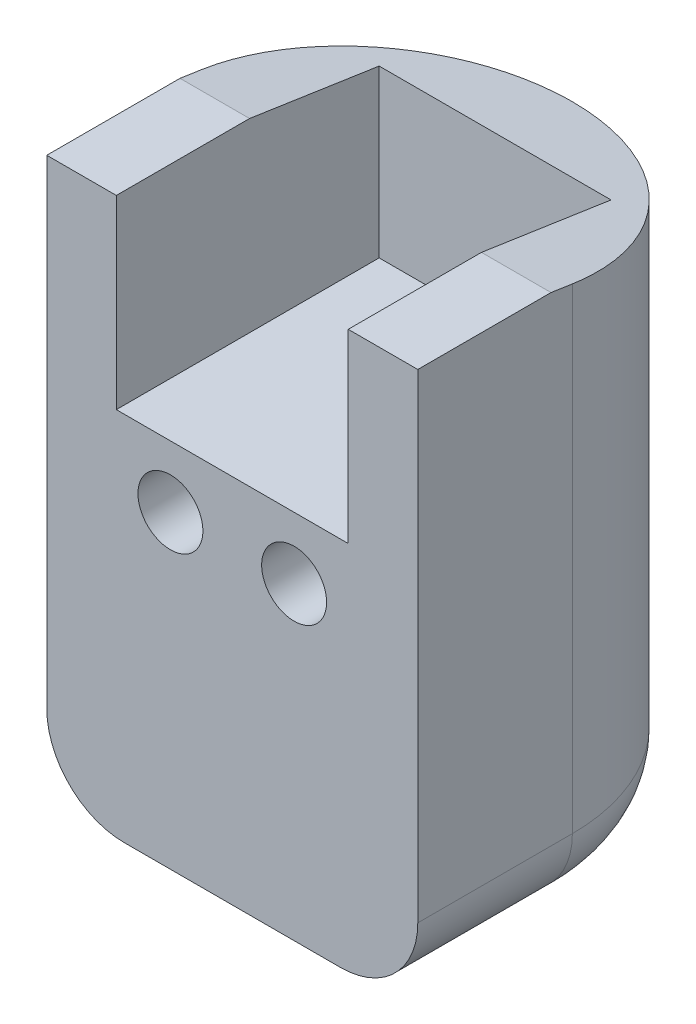
ISO-10303-21;
HEADER;
FILE_DESCRIPTION(('STEP AP214'),'2;1');
FILE_NAME('part.step','',(''),(''),'','','');
FILE_SCHEMA(('AUTOMOTIVE_DESIGN { 1 0 10303 214 1 1 1 1 }'));
ENDSEC;
DATA;
#1=APPLICATION_CONTEXT('core data for automotive mechanical design processes');
#2=APPLICATION_PROTOCOL_DEFINITION('international standard','automotive_design',2000,#1);
#3=PRODUCT_CONTEXT('',#1,'mechanical');
#4=PRODUCT('Part','Part','',(#3));
#5=PRODUCT_RELATED_PRODUCT_CATEGORY('part','',(#4));
#6=PRODUCT_DEFINITION_FORMATION('','',#4);
#7=PRODUCT_DEFINITION_CONTEXT('part definition',#1,'design');
#8=PRODUCT_DEFINITION('design','',#6,#7);
#9=PRODUCT_DEFINITION_SHAPE('','',#8);
#10=(LENGTH_UNIT() NAMED_UNIT(*) SI_UNIT(.MILLI.,.METRE.));
#11=(NAMED_UNIT(*) PLANE_ANGLE_UNIT() SI_UNIT($,.RADIAN.));
#12=(NAMED_UNIT(*) SI_UNIT($,.STERADIAN.) SOLID_ANGLE_UNIT());
#13=UNCERTAINTY_MEASURE_WITH_UNIT(LENGTH_MEASURE(1.E-05),#10,'distance_accuracy_value','');
#14=(GEOMETRIC_REPRESENTATION_CONTEXT(3) GLOBAL_UNCERTAINTY_ASSIGNED_CONTEXT((#13)) GLOBAL_UNIT_ASSIGNED_CONTEXT((#10,
#11,#12)) REPRESENTATION_CONTEXT('',''));
#15=CARTESIAN_POINT('',(0.,0.,0.));
#16=DIRECTION('',(0.,0.,1.));
#17=DIRECTION('',(1.,0.,0.));
#18=AXIS2_PLACEMENT_3D('',#15,#16,#17);
#19=CARTESIAN_POINT('',(-7.5,0.,10.));
#20=DIRECTION('',(0.,-1.,0.));
#21=DIRECTION('',(1.,0.,0.));
#22=AXIS2_PLACEMENT_3D('',#19,#20,#21);
#23=PLANE('',#22);
#24=DIRECTION('',(0.,0.,-1.));
#25=VECTOR('',#24,1.);
#26=CARTESIAN_POINT('',(12.,0.,10.));
#27=LINE('',#26,#25);
#28=CARTESIAN_POINT('',(12.,0.,10.));
#29=VERTEX_POINT('',#28);
#30=CARTESIAN_POINT('',(12.,0.,1.38231247663545));
#31=VERTEX_POINT('',#30);
#32=EDGE_CURVE('E205',#29,#31,#27,.T.);
#33=ORIENTED_EDGE('',*,*,#32,.T.);
#34=DIRECTION('',(1.,0.,0.));
#35=VECTOR('',#34,1.);
#36=CARTESIAN_POINT('',(-15.,0.,1.38231247663545));
#37=LINE('',#36,#35);
#38=CARTESIAN_POINT('',(7.5,0.,1.38231247663545));
#39=VERTEX_POINT('',#38);
#40=EDGE_CURVE('E177',#39,#31,#37,.T.);
#41=ORIENTED_EDGE('',*,*,#40,.F.);
#42=DIRECTION('',(0.,0.,-1.));
#43=VECTOR('',#42,1.);
#44=CARTESIAN_POINT('',(7.5,0.,10.));
#45=LINE('',#44,#43);
#46=CARTESIAN_POINT('',(7.5,0.,10.));
#47=VERTEX_POINT('',#46);
#48=EDGE_CURVE('E214',#47,#39,#45,.T.);
#49=ORIENTED_EDGE('',*,*,#48,.F.);
#50=DIRECTION('',(-1.,0.,0.));
#51=VECTOR('',#50,1.);
#52=CARTESIAN_POINT('',(12.,0.,10.));
#53=LINE('',#52,#51);
#54=EDGE_CURVE('E146',#29,#47,#53,.T.);
#55=ORIENTED_EDGE('',*,*,#54,.F.);
#56=EDGE_LOOP('',(#33,#41,#49,#55));
#57=FACE_BOUND('',#56,.T.);
#58=ADVANCED_FACE('F36',(#57),#23,.F.);
#59=CARTESIAN_POINT('',(7.5,-11.,10.));
#60=DIRECTION('',(1.,0.,0.));
#61=DIRECTION('',(0.,1.,0.));
#62=AXIS2_PLACEMENT_3D('',#59,#60,#61);
#63=PLANE('',#62);
#64=ORIENTED_EDGE('',*,*,#48,.T.);
#65=DIRECTION('',(0.,-0.147809411129604,-0.989015863361918));
#66=VECTOR('',#65,1.);
#67=CARTESIAN_POINT('',(7.5,1.01946015378364,8.20367964434118));
#68=LINE('',#67,#66);
#69=CARTESIAN_POINT('',(7.5,-1.2527449932544,-7.));
#70=VERTEX_POINT('',#69);
#71=EDGE_CURVE('E184',#39,#70,#68,.T.);
#72=ORIENTED_EDGE('',*,*,#71,.T.);
#73=DIRECTION('',(0.,-1.,0.));
#74=VECTOR('',#73,1.);
#75=CARTESIAN_POINT('',(7.5,26.8328157299975,-7.));
#76=LINE('',#75,#74);
#77=CARTESIAN_POINT('',(7.5,-12.,-7.));
#78=VERTEX_POINT('',#77);
#79=EDGE_CURVE('E157',#70,#78,#76,.T.);
#80=ORIENTED_EDGE('',*,*,#79,.T.);
#81=DIRECTION('',(0.,0.,-1.));
#82=VECTOR('',#81,1.);
#83=CARTESIAN_POINT('',(7.5,-12.,10.));
#84=LINE('',#83,#82);
#85=CARTESIAN_POINT('',(7.5,-12.,10.));
#86=VERTEX_POINT('',#85);
#87=EDGE_CURVE('E153',#86,#78,#84,.T.);
#88=ORIENTED_EDGE('',*,*,#87,.F.);
#89=DIRECTION('',(0.,-1.,0.));
#90=VECTOR('',#89,1.);
#91=CARTESIAN_POINT('',(7.5,-11.,10.));
#92=LINE('',#91,#90);
#93=EDGE_CURVE('E139',#47,#86,#92,.T.);
#94=ORIENTED_EDGE('',*,*,#93,.F.);
#95=EDGE_LOOP('',(#64,#72,#80,#88,#94));
#96=FACE_BOUND('',#95,.T.);
#97=ADVANCED_FACE('F154',(#96),#63,.F.);
#98=CARTESIAN_POINT('',(-7.5,0.,10.));
#99=DIRECTION('',(-1.,0.,0.));
#100=DIRECTION('',(0.,-1.,0.));
#101=AXIS2_PLACEMENT_3D('',#98,#99,#100);
#102=PLANE('',#101);
#103=DIRECTION('',(0.,-1.,0.));
#104=VECTOR('',#103,1.);
#105=CARTESIAN_POINT('',(-7.5,26.8328157299975,-7.));
#106=LINE('',#105,#104);
#107=CARTESIAN_POINT('',(-7.5,-1.2527449932544,-7.));
#108=VERTEX_POINT('',#107);
#109=CARTESIAN_POINT('',(-7.5,-12.,-7.));
#110=VERTEX_POINT('',#109);
#111=EDGE_CURVE('E192',#108,#110,#106,.T.);
#112=ORIENTED_EDGE('',*,*,#111,.F.);
#113=DIRECTION('',(0.,0.147809411129604,0.989015863361918));
#114=VECTOR('',#113,1.);
#115=CARTESIAN_POINT('',(-7.5,1.25978399598692,9.81172402031616));
#116=LINE('',#115,#114);
#117=CARTESIAN_POINT('',(-7.5,0.,1.38231247663545));
#118=VERTEX_POINT('',#117);
#119=EDGE_CURVE('E181',#108,#118,#116,.T.);
#120=ORIENTED_EDGE('',*,*,#119,.T.);
#121=DIRECTION('',(0.,0.,-1.));
#122=VECTOR('',#121,1.);
#123=CARTESIAN_POINT('',(-7.5,0.,10.));
#124=LINE('',#123,#122);
#125=CARTESIAN_POINT('',(-7.5,0.,10.));
#126=VERTEX_POINT('',#125);
#127=EDGE_CURVE('E211',#126,#118,#124,.T.);
#128=ORIENTED_EDGE('',*,*,#127,.F.);
#129=DIRECTION('',(0.,1.,0.));
#130=VECTOR('',#129,1.);
#131=CARTESIAN_POINT('',(-7.5,0.,10.));
#132=LINE('',#131,#130);
#133=CARTESIAN_POINT('',(-7.5,-12.,10.));
#134=VERTEX_POINT('',#133);
#135=EDGE_CURVE('E150',#134,#126,#132,.T.);
#136=ORIENTED_EDGE('',*,*,#135,.F.);
#137=DIRECTION('',(0.,0.,1.));
#138=VECTOR('',#137,1.);
#139=CARTESIAN_POINT('',(-7.5,-12.,-7.));
#140=LINE('',#139,#138);
#141=EDGE_CURVE('E166',#110,#134,#140,.T.);
#142=ORIENTED_EDGE('',*,*,#141,.F.);
#143=EDGE_LOOP('',(#112,#120,#128,#136,#142));
#144=FACE_BOUND('',#143,.T.);
#145=ADVANCED_FACE('F312',(#144),#102,.F.);
#146=ORIENTED_EDGE('',*,*,#127,.T.);
#147=CARTESIAN_POINT('',(-12.,0.,1.38231247663545));
#148=VERTEX_POINT('',#147);
#149=EDGE_CURVE('E180',#148,#118,#37,.T.);
#150=ORIENTED_EDGE('',*,*,#149,.F.);
#151=DIRECTION('',(0.,0.,-1.));
#152=VECTOR('',#151,1.);
#153=CARTESIAN_POINT('',(-12.,0.,10.));
#154=LINE('',#153,#152);
#155=CARTESIAN_POINT('',(-12.,0.,10.));
#156=VERTEX_POINT('',#155);
#157=EDGE_CURVE('E208',#156,#148,#154,.T.);
#158=ORIENTED_EDGE('',*,*,#157,.F.);
#159=DIRECTION('',(-1.,0.,0.));
#160=VECTOR('',#159,1.);
#161=CARTESIAN_POINT('',(-7.5,0.,10.));
#162=LINE('',#161,#160);
#163=EDGE_CURVE('E196',#126,#156,#162,.T.);
#164=ORIENTED_EDGE('',*,*,#163,.F.);
#165=EDGE_LOOP('',(#146,#150,#158,#164));
#166=FACE_BOUND('',#165,.T.);
#167=ADVANCED_FACE('F308',(#166),#23,.F.);
#168=CARTESIAN_POINT('',(-12.,0.,10.));
#169=DIRECTION('',(1.,0.,0.));
#170=DIRECTION('',(0.,1.,0.));
#171=AXIS2_PLACEMENT_3D('',#168,#169,#170);
#172=PLANE('',#171);
#173=DIRECTION('',(0.,1.,0.));
#174=VECTOR('',#173,1.);
#175=CARTESIAN_POINT('',(-12.,-36.,0.));
#176=LINE('',#175,#174);
#177=CARTESIAN_POINT('',(-12.,-0.206587983810551,0.));
#178=VERTEX_POINT('',#177);
#179=CARTESIAN_POINT('',(-12.,-31.,0.));
#180=VERTEX_POINT('',#179);
#181=EDGE_CURVE('E223',#178,#180,#176,.F.);
#182=ORIENTED_EDGE('',*,*,#181,.T.);
#183=DIRECTION('',(0.,0.,-1.));
#184=VECTOR('',#183,1.);
#185=CARTESIAN_POINT('',(-12.,-31.,10.));
#186=LINE('',#185,#184);
#187=CARTESIAN_POINT('',(-12.,-31.,10.));
#188=VERTEX_POINT('',#187);
#189=EDGE_CURVE('E237',#180,#188,#186,.F.);
#190=ORIENTED_EDGE('',*,*,#189,.T.);
#191=DIRECTION('',(0.,-1.,0.));
#192=VECTOR('',#191,1.);
#193=CARTESIAN_POINT('',(-12.,0.,10.));
#194=LINE('',#193,#192);
#195=EDGE_CURVE('E198',#156,#188,#194,.T.);
#196=ORIENTED_EDGE('',*,*,#195,.F.);
#197=ORIENTED_EDGE('',*,*,#157,.T.);
#198=DIRECTION('',(0.,-0.147809411129604,-0.989015863361918));
#199=VECTOR('',#198,1.);
#200=CARTESIAN_POINT('',(-12.,1.25978399598692,9.81172402031616));
#201=LINE('',#200,#199);
#202=EDGE_CURVE('E188',#148,#178,#201,.T.);
#203=ORIENTED_EDGE('',*,*,#202,.T.);
#204=EDGE_LOOP('',(#182,#190,#196,#197,#203));
#205=FACE_BOUND('',#204,.T.);
#206=ADVANCED_FACE('F304',(#205),#172,.F.);
#207=CARTESIAN_POINT('',(-12.,-36.,10.));
#208=DIRECTION('',(0.,1.,0.));
#209=DIRECTION('',(0.,0.,1.));
#210=AXIS2_PLACEMENT_3D('',#207,#208,#209);
#211=PLANE('',#210);
#212=DIRECTION('',(1.,0.,0.));
#213=VECTOR('',#212,1.);
#214=CARTESIAN_POINT('',(-12.,-36.,10.));
#215=LINE('',#214,#213);
#216=CARTESIAN_POINT('',(-7.,-36.,10.));
#217=VERTEX_POINT('',#216);
#218=CARTESIAN_POINT('',(7.,-36.,10.));
#219=VERTEX_POINT('',#218);
#220=EDGE_CURVE('E200',#217,#219,#215,.T.);
#221=ORIENTED_EDGE('',*,*,#220,.F.);
#222=DIRECTION('',(0.,0.,-1.));
#223=VECTOR('',#222,1.);
#224=CARTESIAN_POINT('',(-7.,-36.,10.));
#225=LINE('',#224,#223);
#226=CARTESIAN_POINT('',(-7.,-36.,0.));
#227=VERTEX_POINT('',#226);
#228=EDGE_CURVE('E234',#217,#227,#225,.T.);
#229=ORIENTED_EDGE('',*,*,#228,.T.);
#230=CARTESIAN_POINT('',(0.,-36.,0.));
#231=DIRECTION('',(0.,1.,0.));
#232=DIRECTION('',(0.,0.,1.));
#233=AXIS2_PLACEMENT_3D('',#230,#231,#232);
#234=CIRCLE('',#233,7.);
#235=CARTESIAN_POINT('',(0.,-36.,-7.));
#236=VERTEX_POINT('',#235);
#237=EDGE_CURVE('E232',#227,#236,#234,.F.);
#238=ORIENTED_EDGE('',*,*,#237,.T.);
#239=CARTESIAN_POINT('',(0.,-36.,0.));
#240=DIRECTION('',(0.,1.,0.));
#241=DIRECTION('',(0.,0.,1.));
#242=AXIS2_PLACEMENT_3D('',#239,#240,#241);
#243=CIRCLE('',#242,7.);
#244=CARTESIAN_POINT('',(7.,-36.,0.));
#245=VERTEX_POINT('',#244);
#246=EDGE_CURVE('E230',#236,#245,#243,.F.);
#247=ORIENTED_EDGE('',*,*,#246,.T.);
#248=DIRECTION('',(0.,0.,-1.));
#249=VECTOR('',#248,1.);
#250=CARTESIAN_POINT('',(7.,-36.,10.));
#251=LINE('',#250,#249);
#252=EDGE_CURVE('E227',#245,#219,#251,.F.);
#253=ORIENTED_EDGE('',*,*,#252,.T.);
#254=EDGE_LOOP('',(#221,#229,#238,#247,#253));
#255=FACE_BOUND('',#254,.T.);
#256=ADVANCED_FACE('F301',(#255),#211,.F.);
#257=CARTESIAN_POINT('',(12.,-36.,10.));
#258=DIRECTION('',(-1.,0.,0.));
#259=DIRECTION('',(0.,-1.,0.));
#260=AXIS2_PLACEMENT_3D('',#257,#258,#259);
#261=PLANE('',#260);
#262=DIRECTION('',(0.,1.,0.));
#263=VECTOR('',#262,1.);
#264=CARTESIAN_POINT('',(12.,-36.,10.));
#265=LINE('',#264,#263);
#266=CARTESIAN_POINT('',(12.,-31.,10.));
#267=VERTEX_POINT('',#266);
#268=EDGE_CURVE('E203',#267,#29,#265,.T.);
#269=ORIENTED_EDGE('',*,*,#268,.F.);
#270=DIRECTION('',(0.,0.,-1.));
#271=VECTOR('',#270,1.);
#272=CARTESIAN_POINT('',(12.,-31.,10.));
#273=LINE('',#272,#271);
#274=CARTESIAN_POINT('',(12.,-31.,0.));
#275=VERTEX_POINT('',#274);
#276=EDGE_CURVE('E11',#267,#275,#273,.T.);
#277=ORIENTED_EDGE('',*,*,#276,.T.);
#278=DIRECTION('',(0.,-1.,0.));
#279=VECTOR('',#278,1.);
#280=CARTESIAN_POINT('',(12.,-2.,0.));
#281=LINE('',#280,#279);
#282=CARTESIAN_POINT('',(12.,-0.206587983810555,0.));
#283=VERTEX_POINT('',#282);
#284=EDGE_CURVE('E226',#275,#283,#281,.F.);
#285=ORIENTED_EDGE('',*,*,#284,.T.);
#286=DIRECTION('',(0.,0.147809411129604,0.989015863361918));
#287=VECTOR('',#286,1.);
#288=CARTESIAN_POINT('',(12.,0.473269603321627,4.54903333530713));
#289=LINE('',#288,#287);
#290=EDGE_CURVE('E186',#283,#31,#289,.T.);
#291=ORIENTED_EDGE('',*,*,#290,.T.);
#292=ORIENTED_EDGE('',*,*,#32,.F.);
#293=EDGE_LOOP('',(#269,#277,#285,#291,#292));
#294=FACE_BOUND('',#293,.T.);
#295=ADVANCED_FACE('F297',(#294),#261,.F.);
#296=CARTESIAN_POINT('',(0.,0.,10.));
#297=DIRECTION('',(0.,0.,-1.));
#298=DIRECTION('',(-1.,0.,0.));
#299=AXIS2_PLACEMENT_3D('',#296,#297,#298);
#300=PLANE('',#299);
#301=CARTESIAN_POINT('',(-4.,-16.,10.));
#302=DIRECTION('',(0.,0.,1.));
#303=DIRECTION('',(-1.,0.,0.));
#304=AXIS2_PLACEMENT_3D('',#301,#302,#303);
#305=CIRCLE('',#304,2.1);
#306=CARTESIAN_POINT('',(-6.1,-16.,10.));
#307=VERTEX_POINT('',#306);
#308=EDGE_CURVE('E263',#307,#307,#305,.T.);
#309=ORIENTED_EDGE('',*,*,#308,.F.);
#310=EDGE_LOOP('',(#309));
#311=FACE_BOUND('',#310,.T.);
#312=CARTESIAN_POINT('',(4.,-16.,10.));
#313=DIRECTION('',(0.,0.,1.));
#314=DIRECTION('',(1.,0.,0.));
#315=AXIS2_PLACEMENT_3D('',#312,#313,#314);
#316=CIRCLE('',#315,2.1);
#317=CARTESIAN_POINT('',(6.1,-16.,10.));
#318=VERTEX_POINT('',#317);
#319=EDGE_CURVE('E172',#318,#318,#316,.T.);
#320=ORIENTED_EDGE('',*,*,#319,.F.);
#321=EDGE_LOOP('',(#320));
#322=FACE_BOUND('',#321,.T.);
#323=ORIENTED_EDGE('',*,*,#195,.T.);
#324=CARTESIAN_POINT('',(-7.,-31.,10.));
#325=DIRECTION('',(0.,0.,-1.));
#326=DIRECTION('',(-1.,0.,0.));
#327=AXIS2_PLACEMENT_3D('',#324,#325,#326);
#328=CIRCLE('',#327,5.);
#329=EDGE_CURVE('E241',#188,#217,#328,.F.);
#330=ORIENTED_EDGE('',*,*,#329,.T.);
#331=ORIENTED_EDGE('',*,*,#220,.T.);
#332=CARTESIAN_POINT('',(7.,-31.,10.));
#333=DIRECTION('',(0.,0.,-1.));
#334=DIRECTION('',(-1.,0.,0.));
#335=AXIS2_PLACEMENT_3D('',#332,#333,#334);
#336=CIRCLE('',#335,5.);
#337=EDGE_CURVE('E239',#219,#267,#336,.F.);
#338=ORIENTED_EDGE('',*,*,#337,.T.);
#339=ORIENTED_EDGE('',*,*,#268,.T.);
#340=ORIENTED_EDGE('',*,*,#54,.T.);
#341=ORIENTED_EDGE('',*,*,#93,.T.);
#342=DIRECTION('',(1.,0.,0.));
#343=VECTOR('',#342,1.);
#344=CARTESIAN_POINT('',(-7.5,-12.,10.));
#345=LINE('',#344,#343);
#346=EDGE_CURVE('E144',#134,#86,#345,.T.);
#347=ORIENTED_EDGE('',*,*,#346,.F.);
#348=ORIENTED_EDGE('',*,*,#135,.T.);
#349=ORIENTED_EDGE('',*,*,#163,.T.);
#350=EDGE_LOOP('',(#323,#330,#331,#338,#339,#340,#341,#347,#348,#349));
#351=FACE_BOUND('',#350,.T.);
#352=ADVANCED_FACE('F142',(#311,#322,#351),#300,.F.);
#353=CARTESIAN_POINT('',(-7.5,26.8328157299975,-7.));
#354=DIRECTION('',(0.,0.,-1.));
#355=DIRECTION('',(-1.,0.,0.));
#356=AXIS2_PLACEMENT_3D('',#353,#354,#355);
#357=PLANE('',#356);
#358=ORIENTED_EDGE('',*,*,#79,.F.);
#359=DIRECTION('',(-1.,0.,0.));
#360=VECTOR('',#359,1.);
#361=CARTESIAN_POINT('',(-7.5,-1.2527449932544,-7.));
#362=LINE('',#361,#360);
#363=EDGE_CURVE('E216',#70,#108,#362,.T.);
#364=ORIENTED_EDGE('',*,*,#363,.T.);
#365=ORIENTED_EDGE('',*,*,#111,.T.);
#366=DIRECTION('',(-1.,0.,0.));
#367=VECTOR('',#366,1.);
#368=CARTESIAN_POINT('',(7.5,-12.,-7.));
#369=LINE('',#368,#367);
#370=EDGE_CURVE('E161',#78,#110,#369,.T.);
#371=ORIENTED_EDGE('',*,*,#370,.F.);
#372=EDGE_LOOP('',(#358,#364,#365,#371));
#373=FACE_BOUND('',#372,.T.);
#374=ADVANCED_FACE('F290',(#373),#357,.F.);
#375=CARTESIAN_POINT('',(-15.,0.,1.38231247663545));
#376=DIRECTION('',(0.,-0.989015863361918,0.147809411129604));
#377=DIRECTION('',(0.,-0.147809411129604,-0.989015863361918));
#378=AXIS2_PLACEMENT_3D('',#375,#376,#377);
#379=PLANE('',#378);
#380=CARTESIAN_POINT('',(0.,-0.20658798381055,0.));
#381=DIRECTION('',(0.,-0.989015863361918,0.147809411129604));
#382=DIRECTION('',(0.,0.147809411129604,0.989015863361918));
#383=AXIS2_PLACEMENT_3D('',#380,#381,#382);
#384=ELLIPSE('',#383,12.1332735343687,12.);
#385=CARTESIAN_POINT('',(0.,-2.,-12.));
#386=VERTEX_POINT('',#385);
#387=EDGE_CURVE('E219',#283,#386,#384,.F.);
#388=ORIENTED_EDGE('',*,*,#387,.T.);
#389=CARTESIAN_POINT('',(0.,-0.20658798381055,0.));
#390=DIRECTION('',(0.,-0.989015863361918,0.147809411129604));
#391=DIRECTION('',(0.,-0.147809411129604,-0.989015863361918));
#392=AXIS2_PLACEMENT_3D('',#389,#390,#391);
#393=ELLIPSE('',#392,12.1332735343687,12.);
#394=EDGE_CURVE('E221',#386,#178,#393,.F.);
#395=ORIENTED_EDGE('',*,*,#394,.T.);
#396=ORIENTED_EDGE('',*,*,#202,.F.);
#397=ORIENTED_EDGE('',*,*,#149,.T.);
#398=ORIENTED_EDGE('',*,*,#119,.F.);
#399=ORIENTED_EDGE('',*,*,#363,.F.);
#400=ORIENTED_EDGE('',*,*,#71,.F.);
#401=ORIENTED_EDGE('',*,*,#40,.T.);
#402=ORIENTED_EDGE('',*,*,#290,.F.);
#403=EDGE_LOOP('',(#388,#395,#396,#397,#398,#399,#400,#401,#402));
#404=FACE_BOUND('',#403,.T.);
#405=ADVANCED_FACE('F287',(#404),#379,.F.);
#406=CARTESIAN_POINT('',(0.,-12.,0.));
#407=DIRECTION('',(0.,1.,0.));
#408=DIRECTION('',(-1.,0.,0.));
#409=AXIS2_PLACEMENT_3D('',#406,#407,#408);
#410=PLANE('',#409);
#411=ORIENTED_EDGE('',*,*,#346,.T.);
#412=ORIENTED_EDGE('',*,*,#87,.T.);
#413=ORIENTED_EDGE('',*,*,#370,.T.);
#414=ORIENTED_EDGE('',*,*,#141,.T.);
#415=EDGE_LOOP('',(#411,#412,#413,#414));
#416=FACE_BOUND('',#415,.T.);
#417=ADVANCED_FACE('F164',(#416),#410,.T.);
#418=CARTESIAN_POINT('',(0.,0.,0.));
#419=DIRECTION('',(0.,1.,0.));
#420=DIRECTION('',(-1.,0.,0.));
#421=AXIS2_PLACEMENT_3D('',#418,#419,#420);
#422=CYLINDRICAL_SURFACE('',#421,12.);
#423=CARTESIAN_POINT('',(7.5,-16.,-9.3674969975976));
#424=CARTESIAN_POINT('',(7.4999991056876,-16.084888503961,-9.36749804227438));
#425=CARTESIAN_POINT('',(7.49690522084914,-16.1698048029216,-9.36997741508415));
#426=CARTESIAN_POINT('',(7.48458280663904,-16.3389435950387,-9.37982302346788));
#427=CARTESIAN_POINT('',(7.47535016721512,-16.4231655850646,-9.38719253310615));
#428=CARTESIAN_POINT('',(7.4508851117428,-16.5903751772779,-9.40662294957616));
#429=CARTESIAN_POINT('',(7.43563978445456,-16.6733597216363,-9.41869395137573));
#430=CARTESIAN_POINT('',(7.39940631972288,-16.8373172015074,-9.44718548976238));
#431=CARTESIAN_POINT('',(7.37841547843726,-16.9182891702817,-9.46360807409021));
#432=CARTESIAN_POINT('',(7.3076388409915,-17.156154678684,-9.51850712180917));
#433=CARTESIAN_POINT('',(7.24983436533252,-17.309413157577,-9.5627906798396));
#434=CARTESIAN_POINT('',(7.11551266363294,-17.6030354999569,-9.66315025279993));
#435=CARTESIAN_POINT('',(7.0389975686032,-17.7434008293822,-9.71922492470124));
#436=CARTESIAN_POINT('',(6.86054847132676,-18.0243094913548,-9.84612044099187));
#437=CARTESIAN_POINT('',(6.75676668173398,-18.1632515926133,-9.91787833062149));
#438=CARTESIAN_POINT('',(6.53187339042493,-18.422627410522,-10.0674173905456));
#439=CARTESIAN_POINT('',(6.41075079221963,-18.5430491727554,-10.1452024028971));
#440=CARTESIAN_POINT('',(6.12780718844548,-18.7863620504502,-10.3190455989543));
#441=CARTESIAN_POINT('',(5.96267723996513,-18.905015793389,-10.4156709205962));
#442=CARTESIAN_POINT('',(5.61372503632557,-19.1124044776107,-10.6078138116716));
#443=CARTESIAN_POINT('',(5.42989089070778,-19.2011202303636,-10.7033306328979));
#444=CARTESIAN_POINT('',(5.13648766666483,-19.3121526847754,-10.8457128834627));
#445=CARTESIAN_POINT('',(5.03215750589088,-19.3461586081304,-10.8945386791267));
#446=CARTESIAN_POINT('',(4.81988849260674,-19.4043914160917,-10.9900949634666));
#447=CARTESIAN_POINT('',(4.71195117688801,-19.4286224091156,-11.0368263250797));
#448=CARTESIAN_POINT('',(4.4931947255749,-19.4668560644929,-11.1276788332951));
#449=CARTESIAN_POINT('',(4.38237542380199,-19.4808581356749,-11.1717998288982));
#450=CARTESIAN_POINT('',(4.15878658213689,-19.4981922074826,-11.2569440414399));
#451=CARTESIAN_POINT('',(4.04601819106857,-19.5015302915683,-11.2979690115134));
#452=CARTESIAN_POINT('',(3.82750355381387,-19.4973315650979,-11.3737694860422));
#453=CARTESIAN_POINT('',(3.72182484020862,-19.4905473047275,-11.4087817811658));
#454=CARTESIAN_POINT('',(3.51056213479567,-19.4672375618317,-11.4755486361801));
#455=CARTESIAN_POINT('',(3.40497812218881,-19.4507170652374,-11.5073048537447));
#456=CARTESIAN_POINT('',(3.19487560873265,-19.4078243577353,-11.5673984108638));
#457=CARTESIAN_POINT('',(3.0903567842854,-19.3814552363423,-11.5957368189012));
#458=CARTESIAN_POINT('',(2.88340137437494,-19.3188689349936,-11.6489230724029));
#459=CARTESIAN_POINT('',(2.78096460475466,-19.2826526301278,-11.6737712277382));
#460=CARTESIAN_POINT('',(2.58915381181241,-19.2045529784723,-11.7177214558332));
#461=CARTESIAN_POINT('',(2.4994844841485,-19.163574716193,-11.7371481322814));
#462=CARTESIAN_POINT('',(2.32346328921932,-19.0739199050923,-11.773257537906));
#463=CARTESIAN_POINT('',(2.23711252391562,-19.0252408261273,-11.7899393615586));
#464=CARTESIAN_POINT('',(2.06856871783751,-18.9205147122474,-11.8206749696418));
#465=CARTESIAN_POINT('',(1.9863733924116,-18.8644717883265,-11.834730209881));
#466=CARTESIAN_POINT('',(1.8268027106389,-18.7453861126813,-11.8604103893251));
#467=CARTESIAN_POINT('',(1.74942913223171,-18.6823408025057,-11.8720344357467));
#468=CARTESIAN_POINT('',(1.53161356417605,-18.4887097335116,-11.9027317793863));
#469=CARTESIAN_POINT('',(1.39846712273207,-18.3492441797109,-11.9188497755241));
#470=CARTESIAN_POINT('',(1.15672030195146,-18.0500757700417,-11.9447421012879));
#471=CARTESIAN_POINT('',(1.04812004017847,-17.890372817252,-11.9545164005313));
#472=CARTESIAN_POINT('',(0.857995708879247,-17.5541265326588,-11.969670593719));
#473=CARTESIAN_POINT('',(0.776635595813972,-17.3774891769639,-11.9750241525955));
#474=CARTESIAN_POINT('',(0.644238712680508,-17.0131394301091,-11.9828788492364));
#475=CARTESIAN_POINT('',(0.593203604016627,-16.8254264327715,-11.9853798307246));
#476=CARTESIAN_POINT('',(0.522495247454113,-16.4420127821586,-11.9886731565736));
#477=CARTESIAN_POINT('',(0.503175151886324,-16.2462467415487,-11.9894462949078));
#478=CARTESIAN_POINT('',(0.497546102220273,-15.8542372746457,-11.9896812335378));
#479=CARTESIAN_POINT('',(0.511238149969791,-15.6579938340451,-11.989142994036));
#480=CARTESIAN_POINT('',(0.571334950078474,-15.2699961828956,-11.986428645023));
#481=CARTESIAN_POINT('',(0.61783595644197,-15.078256901008,-11.9842477149575));
#482=CARTESIAN_POINT('',(0.742320932652093,-14.7053308037439,-11.9771790639667));
#483=CARTESIAN_POINT('',(0.820305272124987,-14.5241441122875,-11.9722913112621));
#484=CARTESIAN_POINT('',(1.00528712107453,-14.1778730397701,-11.958174889765));
#485=CARTESIAN_POINT('',(1.11222755159424,-14.0127578396099,-11.9489547350899));
#486=CARTESIAN_POINT('',(1.35193700775095,-13.7030239147715,-11.9242078766218));
#487=CARTESIAN_POINT('',(1.48470337890605,-13.5584030862474,-11.9086818207933));
#488=CARTESIAN_POINT('',(1.77037662750088,-13.2951672577507,-11.8695531286935));
#489=CARTESIAN_POINT('',(1.92306552180528,-13.1763033199936,-11.846034024807));
#490=CARTESIAN_POINT('',(2.24461188097972,-12.9659408372395,-11.7893306884929));
#491=CARTESIAN_POINT('',(2.41346719248222,-12.8744386543318,-11.7561477420907));
#492=CARTESIAN_POINT('',(2.76023506331246,-12.721496720102,-11.679568758477));
#493=CARTESIAN_POINT('',(2.93805455012402,-12.6597988135723,-11.6362654286967));
#494=CARTESIAN_POINT('',(3.29855168876558,-12.5659527076461,-11.5392549026384));
#495=CARTESIAN_POINT('',(3.48122985474731,-12.5338076484742,-11.4855466014834));
#496=CARTESIAN_POINT('',(3.85120557858237,-12.4980948499049,-11.3669241023645));
#497=CARTESIAN_POINT('',(4.03849406433968,-12.4953257196834,-11.3017455163766));
#498=CARTESIAN_POINT('',(4.40794974246744,-12.518925361728,-11.1628396578549));
#499=CARTESIAN_POINT('',(4.59011548296009,-12.5453023108453,-11.0891099915344));
#500=CARTESIAN_POINT('',(4.95989510747034,-12.6284480145353,-10.9290084431978));
#501=CARTESIAN_POINT('',(5.14675969194224,-12.6875004555422,-10.8420964180885));
#502=CARTESIAN_POINT('',(5.50645887928002,-12.8348123578974,-10.6639244643068));
#503=CARTESIAN_POINT('',(5.67928253261598,-12.9230943461371,-10.5726612287863));
#504=CARTESIAN_POINT('',(6.02379742586768,-13.1365728792297,-10.380578276353));
#505=CARTESIAN_POINT('',(6.19375273592249,-13.2645194839984,-10.279690273708));
#506=CARTESIAN_POINT('',(6.50929692586725,-13.5507602809401,-10.082837303913));
#507=CARTESIAN_POINT('',(6.65489421735498,-13.7090439560753,-9.98687064523861));
#508=CARTESIAN_POINT('',(6.89358056741443,-14.0229415640803,-9.82321821330939));
#509=CARTESIAN_POINT('',(6.99140373173408,-14.1739183241475,-9.75354997282268));
#510=CARTESIAN_POINT('',(7.16433001427894,-14.4933737404502,-9.62724469864616));
#511=CARTESIAN_POINT('',(7.23945668892788,-14.6618340050041,-9.57059416875026));
#512=CARTESIAN_POINT('',(7.35331932345384,-14.9852513778055,-9.48330360248023));
#513=CARTESIAN_POINT('',(7.3959476178028,-15.1380789732359,-9.44995657088838));
#514=CARTESIAN_POINT('',(7.44415973910673,-15.3722053365041,-9.41195419839047));
#515=CARTESIAN_POINT('',(7.45760417083318,-15.4509956025258,-9.40129356646854));
#516=CARTESIAN_POINT('',(7.47909514275939,-15.6097479629993,-9.38420652296589));
#517=CARTESIAN_POINT('',(7.48714481396192,-15.6897093501711,-9.37777765539899));
#518=CARTESIAN_POINT('',(7.494951344472,-15.8081983961645,-9.371537342998));
#519=CARTESIAN_POINT('',(7.49684349520052,-15.8465140969621,-9.37002349363692));
#520=CARTESIAN_POINT('',(7.49936809940729,-15.9232179645665,-9.36800302536125));
#521=CARTESIAN_POINT('',(7.50000040448475,-15.9616061393774,-9.36749652510518));
#522=CARTESIAN_POINT('',(7.5,-16.,-9.3674969975976));
#523=B_SPLINE_CURVE_WITH_KNOTS('',3,(#423,#424,#425,#426,#427,#428,#429,#430,#431,#432,#433,
#434,#435,#436,#437,#438,#439,#440,#441,#442,#443,#444,#445,#446,#447,#448,#449,#450,#451,#452,
#453,#454,#455,#456,#457,#458,#459,#460,#461,#462,#463,#464,#465,#466,#467,#468,#469,#470,#471,
#472,#473,#474,#475,#476,#477,#478,#479,#480,#481,#482,#483,#484,#485,#486,#487,#488,#489,#490,
#491,#492,#493,#494,#495,#496,#497,#498,#499,#500,#501,#502,#503,#504,#505,#506,#507,#508,#509,
#510,#511,#512,#513,#514,#515,#516,#517,#518,#519,#520,#521,#522),.UNSPECIFIED.,.T.,.F.,(4,2,2,
2,2,2,2,2,2,2,2,2,2,2,2,2,2,2,2,2,2,2,2,2,2,2,2,2,2,2,2,2,2,2,2,2,2,2,2,2,2,2,2,2,2,2,2,2,2,4),
(0.,0.254621757825701,0.509414163286085,0.764756697956482,1.020219604185,1.52687505924365,
2.03347283658464,2.59450065021592,3.15588908704088,3.82849808677616,4.50153737500892,
4.86145591878781,5.22122303026904,5.58101093251962,5.94059355071396,6.27474052492165,
6.60871653081624,6.94258785627394,7.27642952127083,7.57750521792291,7.87868004081102,
8.17968743639127,8.48080517463711,9.05830239863521,9.63580238849125,10.2167183144492,
10.7976660638899,11.3850399421202,11.9724316461129,12.5615538278225,13.1506829262509,
13.7386590685915,14.3265748085589,14.908526317187,15.4904004174059,16.067139877633,
16.6439406139279,17.2363832303217,17.8289920970474,18.4694890709413,19.1104808223299,
19.813648551771,20.51657295156,21.0931090632085,21.6690447225674,22.1531530781479,
22.3948147453628,22.6363360356112,22.7514842653075,22.8666460578388),.UNSPECIFIED.);
#524=CARTESIAN_POINT('',(7.5,-16.,-9.3674969975976));
#525=VERTEX_POINT('',#524);
#526=EDGE_CURVE('E256',#525,#525,#523,.T.);
#527=ORIENTED_EDGE('',*,*,#526,.F.);
#528=EDGE_LOOP('',(#527));
#529=FACE_BOUND('',#528,.T.);
#530=ORIENTED_EDGE('',*,*,#284,.F.);
#531=CARTESIAN_POINT('',(0.,-31.,0.));
#532=DIRECTION('',(0.,1.,0.));
#533=DIRECTION('',(0.,0.,1.));
#534=AXIS2_PLACEMENT_3D('',#531,#532,#533);
#535=CIRCLE('',#534,12.);
#536=CARTESIAN_POINT('',(0.,-31.,-12.));
#537=VERTEX_POINT('',#536);
#538=EDGE_CURVE('E49',#275,#537,#535,.T.);
#539=ORIENTED_EDGE('',*,*,#538,.T.);
#540=DIRECTION('',(0.,-1.,0.));
#541=VECTOR('',#540,1.);
#542=CARTESIAN_POINT('',(0.,-36.,-12.));
#543=LINE('',#542,#541);
#544=EDGE_CURVE('E167',#386,#537,#543,.T.);
#545=ORIENTED_EDGE('',*,*,#544,.F.);
#546=ORIENTED_EDGE('',*,*,#387,.F.);
#547=EDGE_LOOP('',(#530,#539,#545,#546));
#548=FACE_BOUND('',#547,.T.);
#549=ADVANCED_FACE('F265',(#529,#548),#422,.T.);
#550=CARTESIAN_POINT('',(0.,0.,0.));
#551=DIRECTION('',(0.,-1.,0.));
#552=DIRECTION('',(1.,0.,0.));
#553=AXIS2_PLACEMENT_3D('',#550,#551,#552);
#554=CYLINDRICAL_SURFACE('',#553,12.);
#555=CARTESIAN_POINT('',(-0.5,-16.,-11.9895788082818));
#556=CARTESIAN_POINT('',(-0.500006085137707,-16.1958515278012,-11.9895813583932));
#557=CARTESIAN_POINT('',(-0.516509799814294,-16.3920137706497,-11.988925162284));
#558=CARTESIAN_POINT('',(-0.582153034856469,-16.7791164045262,-11.9859145624103));
#559=CARTESIAN_POINT('',(-0.6313726284726,-16.9700427837883,-11.9835559908032));
#560=CARTESIAN_POINT('',(-0.761057280495975,-17.3408050181686,-11.9760170226307));
#561=CARTESIAN_POINT('',(-0.841499163765029,-17.5206489848826,-11.9708387179017));
#562=CARTESIAN_POINT('',(-1.03121874363848,-17.8640835249177,-11.9559857201889));
#563=CARTESIAN_POINT('',(-1.14047950922934,-18.0276835640769,-11.9463136647389));
#564=CARTESIAN_POINT('',(-1.3839643097097,-18.3333123539602,-11.9205500622013));
#565=CARTESIAN_POINT('',(-1.51807091237111,-18.4754370942964,-11.9044883219238));
#566=CARTESIAN_POINT('',(-1.80732208329704,-18.7349419087981,-11.8640152388651));
#567=CARTESIAN_POINT('',(-1.96246566943397,-18.8523231374801,-11.8396042857923));
#568=CARTESIAN_POINT('',(-2.28658079046837,-19.057867508041,-11.7812680441743));
#569=CARTESIAN_POINT('',(-2.45535166869662,-19.146382814684,-11.7474675355471));
#570=CARTESIAN_POINT('',(-2.80289195029209,-19.2943292538764,-11.6694253853209));
#571=CARTESIAN_POINT('',(-2.98166095009709,-19.3537615593836,-11.625184164917));
#572=CARTESIAN_POINT('',(-3.34471964962324,-19.4432230311049,-11.5259909603518));
#573=CARTESIAN_POINT('',(-3.52903633442244,-19.4730709800661,-11.4709754060518));
#574=CARTESIAN_POINT('',(-3.89691158157812,-19.5033510416789,-11.351279030507));
#575=CARTESIAN_POINT('',(-4.08046994378543,-19.5037758297077,-11.2865958066018));
#576=CARTESIAN_POINT('',(-4.45270854103978,-19.4758967188951,-11.145189363205));
#577=CARTESIAN_POINT('',(-4.64108225304849,-19.4459501073157,-11.0679894051439));
#578=CARTESIAN_POINT('',(-5.00784746149252,-19.3570661963734,-10.9069544039389));
#579=CARTESIAN_POINT('',(-5.1862355982785,-19.2981192043488,-10.8231171503088));
#580=CARTESIAN_POINT('',(-5.54672667762359,-19.1463554291198,-10.6432255609605));
#581=CARTESIAN_POINT('',(-5.72747534046564,-19.0507819025569,-10.5467798124608));
#582=CARTESIAN_POINT('',(-6.06979987875466,-18.8297538743261,-10.3535622331086));
#583=CARTESIAN_POINT('',(-6.23135281179467,-18.7042641450489,-10.2567901514352));
#584=CARTESIAN_POINT('',(-6.54161869168281,-18.4161780438188,-10.0619531341301));
#585=CARTESIAN_POINT('',(-6.68879428903966,-18.2516876091429,-9.9642197740757));
#586=CARTESIAN_POINT('',(-6.95217133806388,-17.8931293381679,-9.78227502360962));
#587=CARTESIAN_POINT('',(-7.06843356685914,-17.6991207351637,-9.69803723191457));
#588=CARTESIAN_POINT('',(-7.23455699657605,-17.3466793228226,-9.57437051840428));
#589=CARTESIAN_POINT('',(-7.29388512744625,-17.1947571654916,-9.52906150396604));
#590=CARTESIAN_POINT('',(-7.39135901594187,-16.8806972234799,-9.45365706845566));
#591=CARTESIAN_POINT('',(-7.42952994230136,-16.7185718335189,-9.42354357454324));
#592=CARTESIAN_POINT('',(-7.48258165062075,-16.387192137384,-9.38148044723694));
#593=CARTESIAN_POINT('',(-7.49732759848365,-16.2179022770692,-9.36963598156474));
#594=CARTESIAN_POINT('',(-7.50200514870161,-15.8787470753664,-9.36589222389587));
#595=CARTESIAN_POINT('',(-7.49193886365447,-15.7088817842022,-9.37399123384387));
#596=CARTESIAN_POINT('',(-7.44970428631715,-15.3890121330599,-9.40757731409611));
#597=CARTESIAN_POINT('',(-7.41953442787596,-15.2385653254878,-9.43149082016567));
#598=CARTESIAN_POINT('',(-7.34081884672896,-14.9454986583558,-9.49288423425273));
#599=CARTESIAN_POINT('',(-7.29226723652377,-14.8028813232761,-9.53036848868275));
#600=CARTESIAN_POINT('',(-7.17421173655769,-14.5166713735492,-9.61959273054995));
#601=CARTESIAN_POINT('',(-7.10332740350301,-14.3739386160361,-9.67224265843819));
#602=CARTESIAN_POINT('',(-6.94491748439509,-14.1020389932181,-9.78660662852803));
#603=CARTESIAN_POINT('',(-6.85738320440161,-13.9728792701569,-9.84832540227294));
#604=CARTESIAN_POINT('',(-6.64880813719553,-13.7047597804968,-9.99060863465764));
#605=CARTESIAN_POINT('',(-6.5245664991089,-13.5689798969731,-10.0724771592549));
#606=CARTESIAN_POINT('',(-6.25792357459475,-13.3194852311523,-10.2402761647724));
#607=CARTESIAN_POINT('',(-6.11550775475665,-13.2057882935496,-10.3262098615092));
#608=CARTESIAN_POINT('',(-5.79055554980532,-12.9852931135746,-10.5123704871231));
#609=CARTESIAN_POINT('',(-5.60525671778895,-12.8825928587316,-10.6126587483305));
#610=CARTESIAN_POINT('',(-5.21699107573224,-12.711556896376,-10.8088013476786));
#611=CARTESIAN_POINT('',(-5.01401996637468,-12.6432295786791,-10.9046545981339));
#612=CARTESIAN_POINT('',(-4.69875637652231,-12.5687247081194,-11.0424275120773));
#613=CARTESIAN_POINT('',(-4.59105981536587,-12.5485127124568,-11.0876510522679));
#614=CARTESIAN_POINT('',(-4.37318156451746,-12.5182168776232,-11.1753760672142));
#615=CARTESIAN_POINT('',(-4.26300109573474,-12.5081281689642,-11.2178788414883));
#616=CARTESIAN_POINT('',(-4.04103530687918,-12.4984776718878,-11.2997360282492));
#617=CARTESIAN_POINT('',(-3.92925018455105,-12.498914597318,-11.3390908248054));
#618=CARTESIAN_POINT('',(-3.70512583442424,-12.5106405588395,-11.4142892057527));
#619=CARTESIAN_POINT('',(-3.59278696981716,-12.521923233872,-11.4501348347017));
#620=CARTESIAN_POINT('',(-3.37924786041772,-12.5539593383904,-11.5148570355544));
#621=CARTESIAN_POINT('',(-3.27799977735224,-12.5737152486577,-11.5440721018036));
#622=CARTESIAN_POINT('',(-3.07687748350451,-12.6223468343491,-11.5992970350601));
#623=CARTESIAN_POINT('',(-2.97700260314669,-12.6512178878181,-11.6253085172156));
#624=CARTESIAN_POINT('',(-2.77953858699516,-12.7180285668465,-11.6740956288996));
#625=CARTESIAN_POINT('',(-2.68194907626462,-12.7559666932581,-11.6968717923634));
#626=CARTESIAN_POINT('',(-2.48999759453602,-12.8407439670783,-11.7392321422659));
#627=CARTESIAN_POINT('',(-2.39563543959247,-12.8875826061948,-11.7588165108636));
#628=CARTESIAN_POINT('',(-2.2187000135022,-12.9856441016046,-11.7934226102645));
#629=CARTESIAN_POINT('',(-2.13579635555766,-13.0361866449208,-11.8086874427418));
#630=CARTESIAN_POINT('',(-1.97417069704081,-13.1442219888738,-11.8367808509551));
#631=CARTESIAN_POINT('',(-1.89545008963753,-13.2017170844387,-11.8496086186422));
#632=CARTESIAN_POINT('',(-1.74292361980027,-13.3232289331514,-11.8730016260199));
#633=CARTESIAN_POINT('',(-1.66911493409761,-13.3872418854915,-11.8835681732878));
#634=CARTESIAN_POINT('',(-1.52696073563152,-13.5213623292992,-11.9026694509781));
#635=CARTESIAN_POINT('',(-1.45861724645931,-13.5914720583387,-11.9112034310972));
#636=CARTESIAN_POINT('',(-1.26526886617353,-13.8072935610363,-11.9338048129371));
#637=CARTESIAN_POINT('',(-1.14874702112274,-13.9610551135643,-11.9453350134648));
#638=CARTESIAN_POINT('',(-0.942426561372393,-14.2858434432684,-11.9633871007208));
#639=CARTESIAN_POINT('',(-0.852643843203724,-14.4568804101732,-11.9699060118415));
#640=CARTESIAN_POINT('',(-0.701441029086651,-14.8136170916306,-11.9797249146594));
#641=CARTESIAN_POINT('',(-0.640382318951973,-14.9994709198377,-11.982984444318));
#642=CARTESIAN_POINT('',(-0.55014504419764,-15.3784677748335,-11.987469127101));
#643=CARTESIAN_POINT('',(-0.520891027652443,-15.5715924204915,-11.9886990986598));
#644=CARTESIAN_POINT('',(-0.505242062990859,-15.804538068559,-11.9893588050345));
#645=CARTESIAN_POINT('',(-0.503277413758277,-15.8436016784532,-11.9894417606322));
#646=CARTESIAN_POINT('',(-0.500655774793433,-15.9217727267118,-11.9895515075621));
#647=CARTESIAN_POINT('',(-0.499998784540589,-15.9608801650588,-11.9895782989167));
#648=CARTESIAN_POINT('',(-0.5,-16.,-11.9895788082818));
#649=B_SPLINE_CURVE_WITH_KNOTS('',3,(#555,#556,#557,#558,#559,#560,#561,#562,#563,#564,#565,
#566,#567,#568,#569,#570,#571,#572,#573,#574,#575,#576,#577,#578,#579,#580,#581,#582,#583,#584,
#585,#586,#587,#588,#589,#590,#591,#592,#593,#594,#595,#596,#597,#598,#599,#600,#601,#602,#603,
#604,#605,#606,#607,#608,#609,#610,#611,#612,#613,#614,#615,#616,#617,#618,#619,#620,#621,#622,
#623,#624,#625,#626,#627,#628,#629,#630,#631,#632,#633,#634,#635,#636,#637,#638,#639,#640,#641,
#642,#643,#644,#645,#646,#647,#648),.UNSPECIFIED.,.T.,.F.,(4,2,2,2,2,2,2,2,2,2,2,2,2,2,2,2,2,2,
2,2,2,2,2,2,2,2,2,2,2,2,2,2,2,2,2,2,2,2,2,2,2,2,2,2,2,2,4),(0.,0.587403369105977,
1.17624974842579,1.76465988239095,2.35272509404778,2.93807865628718,3.52340490025295,
4.10129688785064,4.67916556634048,5.26055246580975,5.84208409563279,6.45683976756778,
7.07180104614634,7.74712862427485,8.42325539207013,9.14373261855078,9.86278270018441,
10.3686060066205,10.8738262841125,11.3819442057592,11.8900188660143,12.3539045029191,
12.8179388438266,13.3196258024631,13.821575444803,14.4235966907261,15.0261024097364,
15.7261663324924,16.4264010454568,16.7816213075737,17.1366706201521,17.4916765486261,
17.846474392208,18.1676895474489,18.4887420871391,18.8097415807527,19.1307227481731,
19.4252277508487,19.7198302317211,20.0142618921242,20.3088020713692,20.8856761075174,
21.4628924163906,22.0471885140217,22.6300954104231,22.747424758064,22.8647540589958),.UNSPECIFIED.);
#650=CARTESIAN_POINT('',(-0.5,-16.,-11.9895788082818));
#651=VERTEX_POINT('',#650);
#652=EDGE_CURVE('E40',#651,#651,#649,.T.);
#653=ORIENTED_EDGE('',*,*,#652,.F.);
#654=EDGE_LOOP('',(#653));
#655=FACE_BOUND('',#654,.T.);
#656=ORIENTED_EDGE('',*,*,#544,.T.);
#657=CARTESIAN_POINT('',(0.,-31.,0.));
#658=DIRECTION('',(0.,1.,0.));
#659=DIRECTION('',(0.,0.,1.));
#660=AXIS2_PLACEMENT_3D('',#657,#658,#659);
#661=CIRCLE('',#660,12.);
#662=EDGE_CURVE('E243',#537,#180,#661,.T.);
#663=ORIENTED_EDGE('',*,*,#662,.T.);
#664=ORIENTED_EDGE('',*,*,#181,.F.);
#665=ORIENTED_EDGE('',*,*,#394,.F.);
#666=EDGE_LOOP('',(#656,#663,#664,#665));
#667=FACE_BOUND('',#666,.T.);
#668=ADVANCED_FACE('F318',(#655,#667),#554,.T.);
#669=CARTESIAN_POINT('',(7.,-31.,10.));
#670=DIRECTION('',(0.,0.,-1.));
#671=DIRECTION('',(-1.,0.,0.));
#672=AXIS2_PLACEMENT_3D('',#669,#670,#671);
#673=CYLINDRICAL_SURFACE('',#672,5.);
#674=ORIENTED_EDGE('',*,*,#337,.F.);
#675=ORIENTED_EDGE('',*,*,#252,.F.);
#676=CARTESIAN_POINT('',(7.00000000000001,-31.,0.));
#677=DIRECTION('',(0.,0.,-1.));
#678=DIRECTION('',(-1.,0.,0.));
#679=AXIS2_PLACEMENT_3D('',#676,#677,#678);
#680=CIRCLE('',#679,5.);
#681=EDGE_CURVE('E169',#275,#245,#680,.T.);
#682=ORIENTED_EDGE('',*,*,#681,.F.);
#683=ORIENTED_EDGE('',*,*,#276,.F.);
#684=EDGE_LOOP('',(#674,#675,#682,#683));
#685=FACE_BOUND('',#684,.T.);
#686=ADVANCED_FACE('F38',(#685),#673,.T.);
#687=CARTESIAN_POINT('',(0.,-31.,0.));
#688=DIRECTION('',(0.,1.,0.));
#689=DIRECTION('',(0.,0.,1.));
#690=AXIS2_PLACEMENT_3D('',#687,#688,#689);
#691=TOROIDAL_SURFACE('',#690,7.,5.);
#692=ORIENTED_EDGE('',*,*,#681,.T.);
#693=ORIENTED_EDGE('',*,*,#246,.F.);
#694=CARTESIAN_POINT('',(0.,-31.,-7.));
#695=DIRECTION('',(-1.,0.,0.));
#696=DIRECTION('',(0.,0.,1.));
#697=AXIS2_PLACEMENT_3D('',#694,#695,#696);
#698=CIRCLE('',#697,5.);
#699=EDGE_CURVE('E248',#537,#236,#698,.T.);
#700=ORIENTED_EDGE('',*,*,#699,.F.);
#701=ORIENTED_EDGE('',*,*,#538,.F.);
#702=EDGE_LOOP('',(#692,#693,#700,#701));
#703=FACE_BOUND('',#702,.T.);
#704=ADVANCED_FACE('F326',(#703),#691,.T.);
#705=CARTESIAN_POINT('',(0.,-31.,0.));
#706=DIRECTION('',(0.,1.,0.));
#707=DIRECTION('',(0.,0.,1.));
#708=AXIS2_PLACEMENT_3D('',#705,#706,#707);
#709=TOROIDAL_SURFACE('',#708,7.,5.);
#710=ORIENTED_EDGE('',*,*,#699,.T.);
#711=ORIENTED_EDGE('',*,*,#237,.F.);
#712=CARTESIAN_POINT('',(-6.99999999999999,-31.,0.));
#713=DIRECTION('',(0.,0.,1.));
#714=DIRECTION('',(1.,0.,0.));
#715=AXIS2_PLACEMENT_3D('',#712,#713,#714);
#716=CIRCLE('',#715,5.);
#717=EDGE_CURVE('E246',#180,#227,#716,.T.);
#718=ORIENTED_EDGE('',*,*,#717,.F.);
#719=ORIENTED_EDGE('',*,*,#662,.F.);
#720=EDGE_LOOP('',(#710,#711,#718,#719));
#721=FACE_BOUND('',#720,.T.);
#722=ADVANCED_FACE('F354',(#721),#709,.T.);
#723=CARTESIAN_POINT('',(-7.,-31.,10.));
#724=DIRECTION('',(0.,0.,-1.));
#725=DIRECTION('',(-1.,0.,0.));
#726=AXIS2_PLACEMENT_3D('',#723,#724,#725);
#727=CYLINDRICAL_SURFACE('',#726,5.);
#728=ORIENTED_EDGE('',*,*,#329,.F.);
#729=ORIENTED_EDGE('',*,*,#189,.F.);
#730=ORIENTED_EDGE('',*,*,#717,.T.);
#731=ORIENTED_EDGE('',*,*,#228,.F.);
#732=EDGE_LOOP('',(#728,#729,#730,#731));
#733=FACE_BOUND('',#732,.T.);
#734=ADVANCED_FACE('F283',(#733),#727,.T.);
#735=CARTESIAN_POINT('',(4.,-16.,-20.));
#736=DIRECTION('',(0.,0.,1.));
#737=DIRECTION('',(1.,0.,0.));
#738=AXIS2_PLACEMENT_3D('',#735,#736,#737);
#739=CYLINDRICAL_SURFACE('',#738,2.1);
#740=CARTESIAN_POINT('',(4.,-16.,-5.));
#741=DIRECTION('',(0.,0.,1.));
#742=DIRECTION('',(1.,0.,0.));
#743=AXIS2_PLACEMENT_3D('',#740,#741,#742);
#744=CIRCLE('',#743,2.1);
#745=CARTESIAN_POINT('',(6.1,-16.,-5.));
#746=VERTEX_POINT('',#745);
#747=EDGE_CURVE('E253',#746,#746,#744,.F.);
#748=ORIENTED_EDGE('',*,*,#747,.T.);
#749=EDGE_LOOP('',(#748));
#750=FACE_BOUND('',#749,.T.);
#751=ORIENTED_EDGE('',*,*,#319,.T.);
#752=EDGE_LOOP('',(#751));
#753=FACE_BOUND('',#752,.T.);
#754=ADVANCED_FACE('F279',(#750,#753),#739,.F.);
#755=CARTESIAN_POINT('',(-4.,-16.,-20.));
#756=DIRECTION('',(0.,0.,1.));
#757=DIRECTION('',(1.,0.,0.));
#758=AXIS2_PLACEMENT_3D('',#755,#756,#757);
#759=CYLINDRICAL_SURFACE('',#758,2.1);
#760=CARTESIAN_POINT('',(-4.,-16.,-5.));
#761=DIRECTION('',(0.,0.,1.));
#762=DIRECTION('',(1.,0.,0.));
#763=AXIS2_PLACEMENT_3D('',#760,#761,#762);
#764=CIRCLE('',#763,2.1);
#765=CARTESIAN_POINT('',(-1.9,-16.,-5.));
#766=VERTEX_POINT('',#765);
#767=EDGE_CURVE('E264',#766,#766,#764,.F.);
#768=ORIENTED_EDGE('',*,*,#767,.T.);
#769=EDGE_LOOP('',(#768));
#770=FACE_BOUND('',#769,.T.);
#771=ORIENTED_EDGE('',*,*,#308,.T.);
#772=EDGE_LOOP('',(#771));
#773=FACE_BOUND('',#772,.T.);
#774=ADVANCED_FACE('F276',(#770,#773),#759,.F.);
#775=CARTESIAN_POINT('',(4.,-16.,-5.));
#776=DIRECTION('',(0.,0.,1.));
#777=DIRECTION('',(1.,0.,0.));
#778=AXIS2_PLACEMENT_3D('',#775,#776,#777);
#779=PLANE('',#778);
#780=CARTESIAN_POINT('',(4.,-16.,-5.));
#781=DIRECTION('',(0.,0.,1.));
#782=DIRECTION('',(1.,0.,0.));
#783=AXIS2_PLACEMENT_3D('',#780,#781,#782);
#784=CIRCLE('',#783,3.5);
#785=CARTESIAN_POINT('',(7.5,-16.,-5.));
#786=VERTEX_POINT('',#785);
#787=EDGE_CURVE('E257',#786,#786,#784,.T.);
#788=ORIENTED_EDGE('',*,*,#787,.F.);
#789=EDGE_LOOP('',(#788));
#790=FACE_BOUND('',#789,.T.);
#791=ORIENTED_EDGE('',*,*,#747,.F.);
#792=EDGE_LOOP('',(#791));
#793=FACE_BOUND('',#792,.T.);
#794=ADVANCED_FACE('F274',(#790,#793),#779,.F.);
#795=CARTESIAN_POINT('',(4.,-16.,-15.));
#796=DIRECTION('',(0.,0.,1.));
#797=DIRECTION('',(1.,0.,0.));
#798=AXIS2_PLACEMENT_3D('',#795,#796,#797);
#799=CYLINDRICAL_SURFACE('',#798,3.5);
#800=ORIENTED_EDGE('',*,*,#526,.T.);
#801=EDGE_LOOP('',(#800));
#802=FACE_BOUND('',#801,.T.);
#803=ORIENTED_EDGE('',*,*,#787,.T.);
#804=EDGE_LOOP('',(#803));
#805=FACE_BOUND('',#804,.T.);
#806=ADVANCED_FACE('F268',(#802,#805),#799,.F.);
#807=CARTESIAN_POINT('',(-4.,-16.,-5.));
#808=DIRECTION('',(0.,0.,1.));
#809=DIRECTION('',(1.,0.,0.));
#810=AXIS2_PLACEMENT_3D('',#807,#808,#809);
#811=PLANE('',#810);
#812=CARTESIAN_POINT('',(-4.,-16.,-5.));
#813=DIRECTION('',(0.,0.,1.));
#814=DIRECTION('',(1.,0.,0.));
#815=AXIS2_PLACEMENT_3D('',#812,#813,#814);
#816=CIRCLE('',#815,3.5);
#817=CARTESIAN_POINT('',(-0.5,-16.,-5.));
#818=VERTEX_POINT('',#817);
#819=EDGE_CURVE('E559',#818,#818,#816,.T.);
#820=ORIENTED_EDGE('',*,*,#819,.F.);
#821=EDGE_LOOP('',(#820));
#822=FACE_BOUND('',#821,.T.);
#823=ORIENTED_EDGE('',*,*,#767,.F.);
#824=EDGE_LOOP('',(#823));
#825=FACE_BOUND('',#824,.T.);
#826=ADVANCED_FACE('F273',(#822,#825),#811,.F.);
#827=CARTESIAN_POINT('',(-4.,-16.,-15.));
#828=DIRECTION('',(0.,0.,1.));
#829=DIRECTION('',(1.,0.,0.));
#830=AXIS2_PLACEMENT_3D('',#827,#828,#829);
#831=CYLINDRICAL_SURFACE('',#830,3.5);
#832=ORIENTED_EDGE('',*,*,#652,.T.);
#833=EDGE_LOOP('',(#832));
#834=FACE_BOUND('',#833,.T.);
#835=ORIENTED_EDGE('',*,*,#819,.T.);
#836=EDGE_LOOP('',(#835));
#837=FACE_BOUND('',#836,.T.);
#838=ADVANCED_FACE('F397',(#834,#837),#831,.F.);
#839=CLOSED_SHELL('',(#58,#97,#145,#167,#206,#256,#295,#352,#374,#405,#417,#549,#668,#686,#704,
#722,#734,#754,#774,#794,#806,#826,#838));
#840=MANIFOLD_SOLID_BREP('B2',#839);
#841=ADVANCED_BREP_SHAPE_REPRESENTATION('',(#18,#840),#14);
#842=SHAPE_DEFINITION_REPRESENTATION(#9,#841);
ENDSEC;
END-ISO-10303-21;
